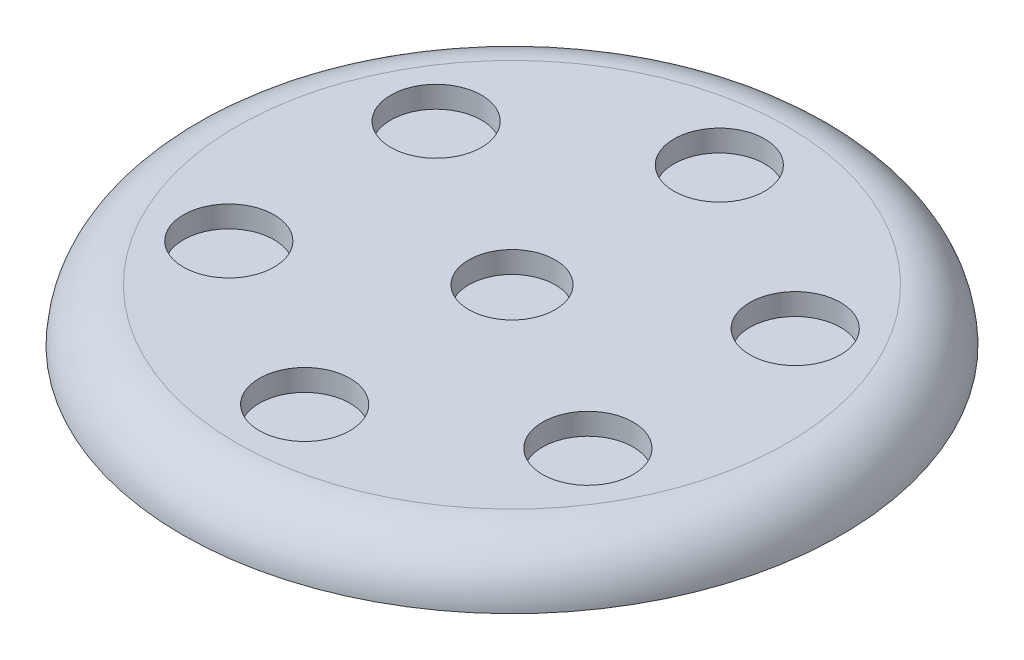
ISO-10303-21;
HEADER;
FILE_DESCRIPTION(('STEP AP214'),'2;1');
FILE_NAME('part.step','',(''),(''),'','','');
FILE_SCHEMA(('AUTOMOTIVE_DESIGN { 1 0 10303 214 1 1 1 1 }'));
ENDSEC;
DATA;
#1=APPLICATION_CONTEXT('core data for automotive mechanical design processes');
#2=APPLICATION_PROTOCOL_DEFINITION('international standard','automotive_design',2000,#1);
#3=PRODUCT_CONTEXT('',#1,'mechanical');
#4=PRODUCT('Part','Part','',(#3));
#5=PRODUCT_RELATED_PRODUCT_CATEGORY('part','',(#4));
#6=PRODUCT_DEFINITION_FORMATION('','',#4);
#7=PRODUCT_DEFINITION_CONTEXT('part definition',#1,'design');
#8=PRODUCT_DEFINITION('design','',#6,#7);
#9=PRODUCT_DEFINITION_SHAPE('','',#8);
#10=(LENGTH_UNIT() NAMED_UNIT(*) SI_UNIT(.MILLI.,.METRE.));
#11=(NAMED_UNIT(*) PLANE_ANGLE_UNIT() SI_UNIT($,.RADIAN.));
#12=(NAMED_UNIT(*) SI_UNIT($,.STERADIAN.) SOLID_ANGLE_UNIT());
#13=UNCERTAINTY_MEASURE_WITH_UNIT(LENGTH_MEASURE(1.E-05),#10,'distance_accuracy_value','');
#14=(GEOMETRIC_REPRESENTATION_CONTEXT(3) GLOBAL_UNCERTAINTY_ASSIGNED_CONTEXT((#13)) GLOBAL_UNIT_ASSIGNED_CONTEXT((#10,
#11,#12)) REPRESENTATION_CONTEXT('',''));
#15=CARTESIAN_POINT('',(0.,0.,0.));
#16=DIRECTION('',(0.,0.,1.));
#17=DIRECTION('',(1.,0.,0.));
#18=AXIS2_PLACEMENT_3D('',#15,#16,#17);
#19=CARTESIAN_POINT('',(0.,12.,0.));
#20=DIRECTION('',(0.,1.,0.));
#21=DIRECTION('',(0.,0.,1.));
#22=AXIS2_PLACEMENT_3D('',#19,#20,#21);
#23=PLANE('',#22);
#24=CARTESIAN_POINT('',(-41.5692193816521,12.,-23.9999999999982));
#25=DIRECTION('',(0.,1.,0.));
#26=DIRECTION('',(0.,0.,1.));
#27=AXIS2_PLACEMENT_3D('',#24,#25,#26);
#28=CIRCLE('',#27,10.5);
#29=CARTESIAN_POINT('',(-41.5692193816521,12.,-13.4999999999982));
#30=VERTEX_POINT('',#29);
#31=EDGE_CURVE('E58',#30,#30,#28,.T.);
#32=ORIENTED_EDGE('',*,*,#31,.F.);
#33=EDGE_LOOP('',(#32));
#34=FACE_BOUND('',#33,.T.);
#35=CARTESIAN_POINT('',(-41.56921938165,12.,24.0000000000018));
#36=DIRECTION('',(0.,1.,0.));
#37=DIRECTION('',(0.,0.,1.));
#38=AXIS2_PLACEMENT_3D('',#35,#36,#37);
#39=CIRCLE('',#38,10.5);
#40=CARTESIAN_POINT('',(-41.56921938165,12.,34.5000000000018));
#41=VERTEX_POINT('',#40);
#42=EDGE_CURVE('E64',#41,#41,#39,.T.);
#43=ORIENTED_EDGE('',*,*,#42,.F.);
#44=EDGE_LOOP('',(#43));
#45=FACE_BOUND('',#44,.T.);
#46=CARTESIAN_POINT('',(4.08187326563618E-12,12.,48.));
#47=DIRECTION('',(0.,1.,0.));
#48=DIRECTION('',(0.,0.,1.));
#49=AXIS2_PLACEMENT_3D('',#46,#47,#48);
#50=CIRCLE('',#49,10.5);
#51=CARTESIAN_POINT('',(4.08187326563618E-12,12.,58.5));
#52=VERTEX_POINT('',#51);
#53=EDGE_CURVE('E70',#52,#52,#50,.T.);
#54=ORIENTED_EDGE('',*,*,#53,.F.);
#55=EDGE_LOOP('',(#54));
#56=FACE_BOUND('',#55,.T.);
#57=CARTESIAN_POINT('',(41.5692193816561,12.,23.9999999999982));
#58=DIRECTION('',(0.,1.,0.));
#59=DIRECTION('',(0.,0.,1.));
#60=AXIS2_PLACEMENT_3D('',#57,#58,#59);
#61=CIRCLE('',#60,10.5);
#62=CARTESIAN_POINT('',(41.5692193816561,12.,34.4999999999982));
#63=VERTEX_POINT('',#62);
#64=EDGE_CURVE('E76',#63,#63,#61,.T.);
#65=ORIENTED_EDGE('',*,*,#64,.F.);
#66=EDGE_LOOP('',(#65));
#67=FACE_BOUND('',#66,.T.);
#68=CARTESIAN_POINT('',(41.5692193816541,12.,-24.0000000000018));
#69=DIRECTION('',(0.,1.,0.));
#70=DIRECTION('',(0.,0.,1.));
#71=AXIS2_PLACEMENT_3D('',#68,#69,#70);
#72=CIRCLE('',#71,10.5);
#73=CARTESIAN_POINT('',(41.5692193816541,12.,-13.5000000000018));
#74=VERTEX_POINT('',#73);
#75=EDGE_CURVE('E82',#74,#74,#72,.T.);
#76=ORIENTED_EDGE('',*,*,#75,.F.);
#77=EDGE_LOOP('',(#76));
#78=FACE_BOUND('',#77,.T.);
#79=CARTESIAN_POINT('',(0.,12.,-48.));
#80=DIRECTION('',(0.,1.,0.));
#81=DIRECTION('',(0.,0.,1.));
#82=AXIS2_PLACEMENT_3D('',#79,#80,#81);
#83=CIRCLE('',#82,10.5);
#84=CARTESIAN_POINT('',(0.,12.,-37.5));
#85=VERTEX_POINT('',#84);
#86=EDGE_CURVE('E53',#85,#85,#83,.T.);
#87=ORIENTED_EDGE('',*,*,#86,.F.);
#88=EDGE_LOOP('',(#87));
#89=FACE_BOUND('',#88,.T.);
#90=CARTESIAN_POINT('',(0.,12.,0.));
#91=DIRECTION('',(0.,1.,0.));
#92=DIRECTION('',(0.,0.,1.));
#93=AXIS2_PLACEMENT_3D('',#90,#91,#92);
#94=CIRCLE('',#93,10.);
#95=CARTESIAN_POINT('',(0.,12.,10.));
#96=VERTEX_POINT('',#95);
#97=EDGE_CURVE('E49',#96,#96,#94,.T.);
#98=ORIENTED_EDGE('',*,*,#97,.F.);
#99=EDGE_LOOP('',(#98));
#100=FACE_BOUND('',#99,.T.);
#101=CARTESIAN_POINT('',(0.,12.,0.));
#102=DIRECTION('',(0.,1.,0.));
#103=DIRECTION('',(0.,0.,1.));
#104=AXIS2_PLACEMENT_3D('',#101,#102,#103);
#105=CIRCLE('',#104,63.6193060126821);
#106=CARTESIAN_POINT('',(0.,12.,63.6193060126821));
#107=VERTEX_POINT('',#106);
#108=EDGE_CURVE('E10',#107,#107,#105,.T.);
#109=ORIENTED_EDGE('',*,*,#108,.T.);
#110=EDGE_LOOP('',(#109));
#111=FACE_BOUND('',#110,.T.);
#112=ADVANCED_FACE('F34',(#34,#45,#56,#67,#78,#89,#100,#111),#23,.T.);
#113=CARTESIAN_POINT('',(0.,0.,0.));
#114=DIRECTION('',(0.,1.,0.));
#115=DIRECTION('',(0.,0.,1.));
#116=AXIS2_PLACEMENT_3D('',#113,#114,#115);
#117=PLANE('',#116);
#118=CARTESIAN_POINT('',(0.,0.,0.));
#119=DIRECTION('',(0.,1.,0.));
#120=DIRECTION('',(0.,0.,1.));
#121=AXIS2_PLACEMENT_3D('',#118,#119,#120);
#122=CIRCLE('',#121,76.3);
#123=CARTESIAN_POINT('',(0.,0.,76.3));
#124=VERTEX_POINT('',#123);
#125=EDGE_CURVE('E41',#124,#124,#122,.T.);
#126=ORIENTED_EDGE('',*,*,#125,.F.);
#127=EDGE_LOOP('',(#126));
#128=FACE_BOUND('',#127,.T.);
#129=ADVANCED_FACE('F95',(#128),#117,.F.);
#130=CARTESIAN_POINT('',(0.,-0.699999999999999,0.));
#131=DIRECTION('',(0.,-1.,0.));
#132=DIRECTION('',(0.,0.,-1.));
#133=AXIS2_PLACEMENT_3D('',#130,#131,#132);
#134=TOROIDAL_SURFACE('',#133,63.6193060126821,12.7);
#135=ORIENTED_EDGE('',*,*,#125,.T.);
#136=EDGE_LOOP('',(#135));
#137=FACE_BOUND('',#136,.T.);
#138=ORIENTED_EDGE('',*,*,#108,.F.);
#139=EDGE_LOOP('',(#138));
#140=FACE_BOUND('',#139,.T.);
#141=ADVANCED_FACE('F36',(#137,#140),#134,.T.);
#142=CARTESIAN_POINT('',(0.,7.,0.));
#143=DIRECTION('',(0.,1.,0.));
#144=DIRECTION('',(0.,0.,1.));
#145=AXIS2_PLACEMENT_3D('',#142,#143,#144);
#146=CYLINDRICAL_SURFACE('',#145,10.);
#147=CARTESIAN_POINT('',(0.,7.,0.));
#148=DIRECTION('',(0.,1.,0.));
#149=DIRECTION('',(0.,0.,1.));
#150=AXIS2_PLACEMENT_3D('',#147,#148,#149);
#151=CIRCLE('',#150,10.);
#152=CARTESIAN_POINT('',(0.,7.,10.));
#153=VERTEX_POINT('',#152);
#154=EDGE_CURVE('E45',#153,#153,#151,.T.);
#155=ORIENTED_EDGE('',*,*,#154,.F.);
#156=EDGE_LOOP('',(#155));
#157=FACE_BOUND('',#156,.T.);
#158=ORIENTED_EDGE('',*,*,#97,.T.);
#159=EDGE_LOOP('',(#158));
#160=FACE_BOUND('',#159,.T.);
#161=ADVANCED_FACE('F100',(#157,#160),#146,.F.);
#162=CARTESIAN_POINT('',(0.,7.,0.));
#163=DIRECTION('',(0.,1.,0.));
#164=DIRECTION('',(0.,0.,1.));
#165=AXIS2_PLACEMENT_3D('',#162,#163,#164);
#166=PLANE('',#165);
#167=ORIENTED_EDGE('',*,*,#154,.T.);
#168=EDGE_LOOP('',(#167));
#169=FACE_BOUND('',#168,.T.);
#170=ADVANCED_FACE('F102',(#169),#166,.T.);
#171=CARTESIAN_POINT('',(0.,7.,-48.));
#172=DIRECTION('',(0.,1.,0.));
#173=DIRECTION('',(0.,0.,1.));
#174=AXIS2_PLACEMENT_3D('',#171,#172,#173);
#175=CYLINDRICAL_SURFACE('',#174,10.5);
#176=CARTESIAN_POINT('',(0.,7.,-48.));
#177=DIRECTION('',(0.,1.,0.));
#178=DIRECTION('',(0.,0.,1.));
#179=AXIS2_PLACEMENT_3D('',#176,#177,#178);
#180=CIRCLE('',#179,10.5);
#181=CARTESIAN_POINT('',(0.,7.,-37.5));
#182=VERTEX_POINT('',#181);
#183=EDGE_CURVE('E85',#182,#182,#180,.T.);
#184=ORIENTED_EDGE('',*,*,#183,.F.);
#185=EDGE_LOOP('',(#184));
#186=FACE_BOUND('',#185,.T.);
#187=ORIENTED_EDGE('',*,*,#86,.T.);
#188=EDGE_LOOP('',(#187));
#189=FACE_BOUND('',#188,.T.);
#190=ADVANCED_FACE('F91',(#186,#189),#175,.F.);
#191=CARTESIAN_POINT('',(0.,7.,-48.));
#192=DIRECTION('',(0.,1.,0.));
#193=DIRECTION('',(0.,0.,1.));
#194=AXIS2_PLACEMENT_3D('',#191,#192,#193);
#195=PLANE('',#194);
#196=ORIENTED_EDGE('',*,*,#183,.T.);
#197=EDGE_LOOP('',(#196));
#198=FACE_BOUND('',#197,.T.);
#199=ADVANCED_FACE('F150',(#198),#195,.T.);
#200=CARTESIAN_POINT('',(41.5692193816541,7.,-24.0000000000018));
#201=DIRECTION('',(0.,1.,0.));
#202=DIRECTION('',(0.,0.,1.));
#203=AXIS2_PLACEMENT_3D('',#200,#201,#202);
#204=CYLINDRICAL_SURFACE('',#203,10.5);
#205=CARTESIAN_POINT('',(41.5692193816541,7.,-24.0000000000018));
#206=DIRECTION('',(0.,1.,0.));
#207=DIRECTION('',(0.,0.,1.));
#208=AXIS2_PLACEMENT_3D('',#205,#206,#207);
#209=CIRCLE('',#208,10.5);
#210=CARTESIAN_POINT('',(41.5692193816541,7.,-13.5000000000018));
#211=VERTEX_POINT('',#210);
#212=EDGE_CURVE('E79',#211,#211,#209,.T.);
#213=ORIENTED_EDGE('',*,*,#212,.F.);
#214=EDGE_LOOP('',(#213));
#215=FACE_BOUND('',#214,.T.);
#216=ORIENTED_EDGE('',*,*,#75,.T.);
#217=EDGE_LOOP('',(#216));
#218=FACE_BOUND('',#217,.T.);
#219=ADVANCED_FACE('F161',(#215,#218),#204,.F.);
#220=CARTESIAN_POINT('',(41.5692193816541,7.,-24.0000000000018));
#221=DIRECTION('',(0.,1.,0.));
#222=DIRECTION('',(0.,0.,1.));
#223=AXIS2_PLACEMENT_3D('',#220,#221,#222);
#224=PLANE('',#223);
#225=ORIENTED_EDGE('',*,*,#212,.T.);
#226=EDGE_LOOP('',(#225));
#227=FACE_BOUND('',#226,.T.);
#228=ADVANCED_FACE('F172',(#227),#224,.T.);
#229=CARTESIAN_POINT('',(41.5692193816561,7.,23.9999999999982));
#230=DIRECTION('',(0.,1.,0.));
#231=DIRECTION('',(0.,0.,1.));
#232=AXIS2_PLACEMENT_3D('',#229,#230,#231);
#233=CYLINDRICAL_SURFACE('',#232,10.5);
#234=CARTESIAN_POINT('',(41.5692193816561,7.,23.9999999999982));
#235=DIRECTION('',(0.,1.,0.));
#236=DIRECTION('',(0.,0.,1.));
#237=AXIS2_PLACEMENT_3D('',#234,#235,#236);
#238=CIRCLE('',#237,10.5);
#239=CARTESIAN_POINT('',(41.5692193816561,7.,34.4999999999982));
#240=VERTEX_POINT('',#239);
#241=EDGE_CURVE('E73',#240,#240,#238,.T.);
#242=ORIENTED_EDGE('',*,*,#241,.F.);
#243=EDGE_LOOP('',(#242));
#244=FACE_BOUND('',#243,.T.);
#245=ORIENTED_EDGE('',*,*,#64,.T.);
#246=EDGE_LOOP('',(#245));
#247=FACE_BOUND('',#246,.T.);
#248=ADVANCED_FACE('F183',(#244,#247),#233,.F.);
#249=CARTESIAN_POINT('',(41.5692193816561,7.,23.9999999999982));
#250=DIRECTION('',(0.,1.,0.));
#251=DIRECTION('',(0.,0.,1.));
#252=AXIS2_PLACEMENT_3D('',#249,#250,#251);
#253=PLANE('',#252);
#254=ORIENTED_EDGE('',*,*,#241,.T.);
#255=EDGE_LOOP('',(#254));
#256=FACE_BOUND('',#255,.T.);
#257=ADVANCED_FACE('F194',(#256),#253,.T.);
#258=CARTESIAN_POINT('',(4.08187326563618E-12,7.,48.));
#259=DIRECTION('',(0.,1.,0.));
#260=DIRECTION('',(0.,0.,1.));
#261=AXIS2_PLACEMENT_3D('',#258,#259,#260);
#262=CYLINDRICAL_SURFACE('',#261,10.5);
#263=CARTESIAN_POINT('',(4.08187326563618E-12,7.,48.));
#264=DIRECTION('',(0.,1.,0.));
#265=DIRECTION('',(0.,0.,1.));
#266=AXIS2_PLACEMENT_3D('',#263,#264,#265);
#267=CIRCLE('',#266,10.5);
#268=CARTESIAN_POINT('',(4.08187326563618E-12,7.,58.5));
#269=VERTEX_POINT('',#268);
#270=EDGE_CURVE('E67',#269,#269,#267,.T.);
#271=ORIENTED_EDGE('',*,*,#270,.F.);
#272=EDGE_LOOP('',(#271));
#273=FACE_BOUND('',#272,.T.);
#274=ORIENTED_EDGE('',*,*,#53,.T.);
#275=EDGE_LOOP('',(#274));
#276=FACE_BOUND('',#275,.T.);
#277=ADVANCED_FACE('F205',(#273,#276),#262,.F.);
#278=CARTESIAN_POINT('',(4.08187326563618E-12,7.,48.));
#279=DIRECTION('',(0.,1.,0.));
#280=DIRECTION('',(0.,0.,1.));
#281=AXIS2_PLACEMENT_3D('',#278,#279,#280);
#282=PLANE('',#281);
#283=ORIENTED_EDGE('',*,*,#270,.T.);
#284=EDGE_LOOP('',(#283));
#285=FACE_BOUND('',#284,.T.);
#286=ADVANCED_FACE('F216',(#285),#282,.T.);
#287=CARTESIAN_POINT('',(-41.56921938165,7.,24.0000000000018));
#288=DIRECTION('',(0.,1.,0.));
#289=DIRECTION('',(0.,0.,1.));
#290=AXIS2_PLACEMENT_3D('',#287,#288,#289);
#291=CYLINDRICAL_SURFACE('',#290,10.5);
#292=CARTESIAN_POINT('',(-41.56921938165,7.,24.0000000000018));
#293=DIRECTION('',(0.,1.,0.));
#294=DIRECTION('',(0.,0.,1.));
#295=AXIS2_PLACEMENT_3D('',#292,#293,#294);
#296=CIRCLE('',#295,10.5);
#297=CARTESIAN_POINT('',(-41.56921938165,7.,34.5000000000018));
#298=VERTEX_POINT('',#297);
#299=EDGE_CURVE('E61',#298,#298,#296,.T.);
#300=ORIENTED_EDGE('',*,*,#299,.F.);
#301=EDGE_LOOP('',(#300));
#302=FACE_BOUND('',#301,.T.);
#303=ORIENTED_EDGE('',*,*,#42,.T.);
#304=EDGE_LOOP('',(#303));
#305=FACE_BOUND('',#304,.T.);
#306=ADVANCED_FACE('F227',(#302,#305),#291,.F.);
#307=CARTESIAN_POINT('',(-41.56921938165,7.,24.0000000000018));
#308=DIRECTION('',(0.,1.,0.));
#309=DIRECTION('',(0.,0.,1.));
#310=AXIS2_PLACEMENT_3D('',#307,#308,#309);
#311=PLANE('',#310);
#312=ORIENTED_EDGE('',*,*,#299,.T.);
#313=EDGE_LOOP('',(#312));
#314=FACE_BOUND('',#313,.T.);
#315=ADVANCED_FACE('F238',(#314),#311,.T.);
#316=CARTESIAN_POINT('',(-41.5692193816521,7.,-23.9999999999982));
#317=DIRECTION('',(0.,1.,0.));
#318=DIRECTION('',(0.,0.,1.));
#319=AXIS2_PLACEMENT_3D('',#316,#317,#318);
#320=CYLINDRICAL_SURFACE('',#319,10.5);
#321=CARTESIAN_POINT('',(-41.5692193816521,7.,-23.9999999999982));
#322=DIRECTION('',(0.,1.,0.));
#323=DIRECTION('',(0.,0.,1.));
#324=AXIS2_PLACEMENT_3D('',#321,#322,#323);
#325=CIRCLE('',#324,10.5);
#326=CARTESIAN_POINT('',(-41.5692193816521,7.,-13.4999999999982));
#327=VERTEX_POINT('',#326);
#328=EDGE_CURVE('E55',#327,#327,#325,.T.);
#329=ORIENTED_EDGE('',*,*,#328,.F.);
#330=EDGE_LOOP('',(#329));
#331=FACE_BOUND('',#330,.T.);
#332=ORIENTED_EDGE('',*,*,#31,.T.);
#333=EDGE_LOOP('',(#332));
#334=FACE_BOUND('',#333,.T.);
#335=ADVANCED_FACE('F249',(#331,#334),#320,.F.);
#336=CARTESIAN_POINT('',(-41.5692193816521,7.,-23.9999999999982));
#337=DIRECTION('',(0.,1.,0.));
#338=DIRECTION('',(0.,0.,1.));
#339=AXIS2_PLACEMENT_3D('',#336,#337,#338);
#340=PLANE('',#339);
#341=ORIENTED_EDGE('',*,*,#328,.T.);
#342=EDGE_LOOP('',(#341));
#343=FACE_BOUND('',#342,.T.);
#344=ADVANCED_FACE('F260',(#343),#340,.T.);
#345=CLOSED_SHELL('',(#112,#129,#141,#161,#170,#190,#199,#219,#228,#248,#257,#277,#286,#306,
#315,#335,#344));
#346=MANIFOLD_SOLID_BREP('B2',#345);
#347=ADVANCED_BREP_SHAPE_REPRESENTATION('',(#18,#346),#14);
#348=SHAPE_DEFINITION_REPRESENTATION(#9,#347);
ENDSEC;
END-ISO-10303-21;
